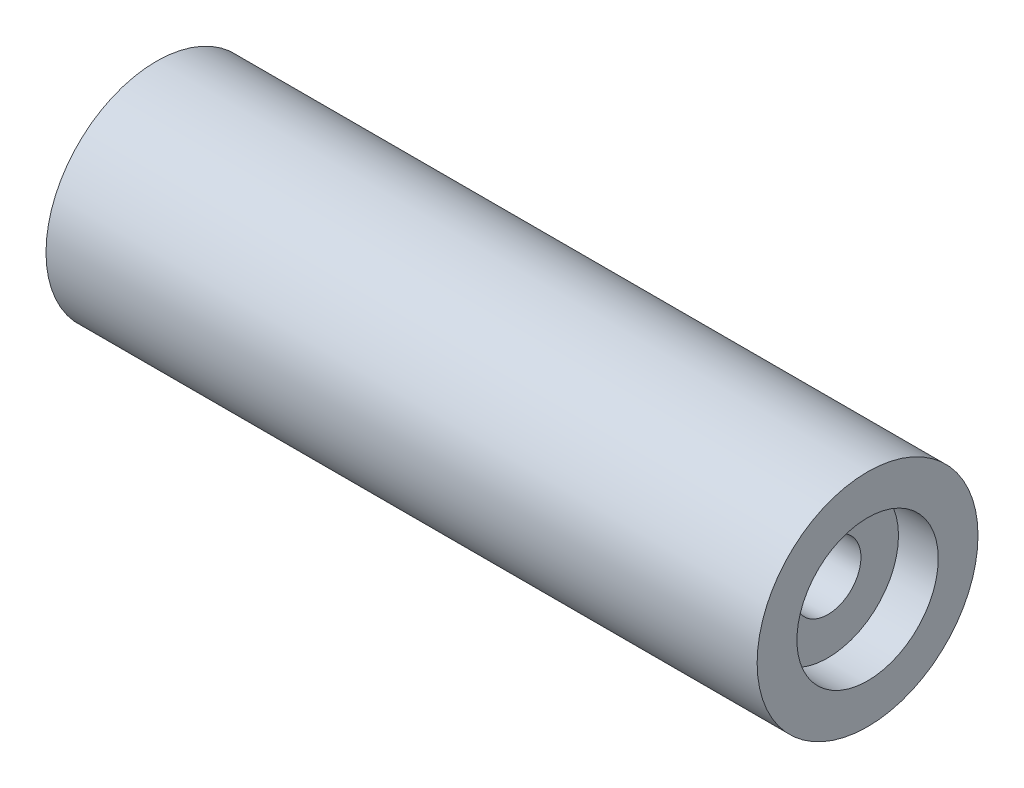
ISO-10303-21;
HEADER;
FILE_DESCRIPTION(('STEP AP214'),'2;1');
FILE_NAME('part.step','',(''),(''),'','','');
FILE_SCHEMA(('AUTOMOTIVE_DESIGN { 1 0 10303 214 1 1 1 1 }'));
ENDSEC;
DATA;
#1=APPLICATION_CONTEXT('core data for automotive mechanical design processes');
#2=APPLICATION_PROTOCOL_DEFINITION('international standard','automotive_design',2000,#1);
#3=PRODUCT_CONTEXT('',#1,'mechanical');
#4=PRODUCT('Part','Part','',(#3));
#5=PRODUCT_RELATED_PRODUCT_CATEGORY('part','',(#4));
#6=PRODUCT_DEFINITION_FORMATION('','',#4);
#7=PRODUCT_DEFINITION_CONTEXT('part definition',#1,'design');
#8=PRODUCT_DEFINITION('design','',#6,#7);
#9=PRODUCT_DEFINITION_SHAPE('','',#8);
#10=(LENGTH_UNIT() NAMED_UNIT(*) SI_UNIT(.MILLI.,.METRE.));
#11=(NAMED_UNIT(*) PLANE_ANGLE_UNIT() SI_UNIT($,.RADIAN.));
#12=(NAMED_UNIT(*) SI_UNIT($,.STERADIAN.) SOLID_ANGLE_UNIT());
#13=UNCERTAINTY_MEASURE_WITH_UNIT(LENGTH_MEASURE(1.E-05),#10,'distance_accuracy_value','');
#14=(GEOMETRIC_REPRESENTATION_CONTEXT(3) GLOBAL_UNCERTAINTY_ASSIGNED_CONTEXT((#13)) GLOBAL_UNIT_ASSIGNED_CONTEXT((#10,
#11,#12)) REPRESENTATION_CONTEXT('',''));
#15=CARTESIAN_POINT('',(0.,0.,0.));
#16=DIRECTION('',(0.,0.,1.));
#17=DIRECTION('',(1.,0.,0.));
#18=AXIS2_PLACEMENT_3D('',#15,#16,#17);
#19=CARTESIAN_POINT('',(80.5,0.,0.));
#20=DIRECTION('',(-1.,0.,0.));
#21=DIRECTION('',(0.,0.,1.));
#22=AXIS2_PLACEMENT_3D('',#19,#20,#21);
#23=CYLINDRICAL_SURFACE('',#22,7.5);
#24=CARTESIAN_POINT('',(71.5,0.,0.));
#25=DIRECTION('',(1.,0.,0.));
#26=DIRECTION('',(0.,0.,-1.));
#27=AXIS2_PLACEMENT_3D('',#24,#25,#26);
#28=CIRCLE('',#27,7.5);
#29=CARTESIAN_POINT('',(71.5,0.,-7.5));
#30=VERTEX_POINT('',#29);
#31=EDGE_CURVE('E59',#30,#30,#28,.T.);
#32=ORIENTED_EDGE('',*,*,#31,.T.);
#33=EDGE_LOOP('',(#32));
#34=FACE_BOUND('',#33,.T.);
#35=CARTESIAN_POINT('',(-71.5,0.,0.));
#36=DIRECTION('',(-1.,0.,0.));
#37=DIRECTION('',(0.,0.,1.));
#38=AXIS2_PLACEMENT_3D('',#35,#36,#37);
#39=CIRCLE('',#38,7.5);
#40=CARTESIAN_POINT('',(-71.5,0.,7.5));
#41=VERTEX_POINT('',#40);
#42=EDGE_CURVE('E50',#41,#41,#39,.T.);
#43=ORIENTED_EDGE('',*,*,#42,.T.);
#44=EDGE_LOOP('',(#43));
#45=FACE_BOUND('',#44,.T.);
#46=ADVANCED_FACE('F46',(#34,#45),#23,.F.);
#47=CARTESIAN_POINT('',(80.5,0.,0.));
#48=DIRECTION('',(1.,0.,0.));
#49=DIRECTION('',(0.,0.,-1.));
#50=AXIS2_PLACEMENT_3D('',#47,#48,#49);
#51=PLANE('',#50);
#52=CARTESIAN_POINT('',(80.5,0.,0.));
#53=DIRECTION('',(1.,0.,0.));
#54=DIRECTION('',(0.,0.,-1.));
#55=AXIS2_PLACEMENT_3D('',#52,#53,#54);
#56=CIRCLE('',#55,16.);
#57=CARTESIAN_POINT('',(80.5,0.,-16.));
#58=VERTEX_POINT('',#57);
#59=EDGE_CURVE('E62',#58,#58,#56,.T.);
#60=ORIENTED_EDGE('',*,*,#59,.F.);
#61=EDGE_LOOP('',(#60));
#62=FACE_BOUND('',#61,.T.);
#63=CARTESIAN_POINT('',(80.5,0.,0.));
#64=DIRECTION('',(1.,0.,0.));
#65=DIRECTION('',(0.,0.,-1.));
#66=AXIS2_PLACEMENT_3D('',#63,#64,#65);
#67=CIRCLE('',#66,25.);
#68=CARTESIAN_POINT('',(80.5,0.,-25.));
#69=VERTEX_POINT('',#68);
#70=EDGE_CURVE('E12',#69,#69,#67,.T.);
#71=ORIENTED_EDGE('',*,*,#70,.T.);
#72=EDGE_LOOP('',(#71));
#73=FACE_BOUND('',#72,.T.);
#74=ADVANCED_FACE('F95',(#62,#73),#51,.T.);
#75=CARTESIAN_POINT('',(-80.5,0.,0.));
#76=DIRECTION('',(1.,0.,0.));
#77=DIRECTION('',(0.,0.,-1.));
#78=AXIS2_PLACEMENT_3D('',#75,#76,#77);
#79=PLANE('',#78);
#80=CARTESIAN_POINT('',(-80.5,0.,0.));
#81=DIRECTION('',(1.,0.,0.));
#82=DIRECTION('',(0.,0.,-1.));
#83=AXIS2_PLACEMENT_3D('',#80,#81,#82);
#84=CIRCLE('',#83,16.);
#85=CARTESIAN_POINT('',(-80.5,0.,-16.));
#86=VERTEX_POINT('',#85);
#87=EDGE_CURVE('E73',#86,#86,#84,.T.);
#88=ORIENTED_EDGE('',*,*,#87,.T.);
#89=EDGE_LOOP('',(#88));
#90=FACE_BOUND('',#89,.T.);
#91=CARTESIAN_POINT('',(-80.5,0.,0.));
#92=DIRECTION('',(1.,0.,0.));
#93=DIRECTION('',(0.,0.,-1.));
#94=AXIS2_PLACEMENT_3D('',#91,#92,#93);
#95=CIRCLE('',#94,25.);
#96=CARTESIAN_POINT('',(-80.5,0.,-25.));
#97=VERTEX_POINT('',#96);
#98=EDGE_CURVE('E54',#97,#97,#95,.T.);
#99=ORIENTED_EDGE('',*,*,#98,.F.);
#100=EDGE_LOOP('',(#99));
#101=FACE_BOUND('',#100,.T.);
#102=ADVANCED_FACE('F100',(#90,#101),#79,.F.);
#103=CARTESIAN_POINT('',(80.5,0.,0.));
#104=DIRECTION('',(-1.,0.,0.));
#105=DIRECTION('',(0.,0.,1.));
#106=AXIS2_PLACEMENT_3D('',#103,#104,#105);
#107=CYLINDRICAL_SURFACE('',#106,25.);
#108=ORIENTED_EDGE('',*,*,#70,.F.);
#109=EDGE_LOOP('',(#108));
#110=FACE_BOUND('',#109,.T.);
#111=ORIENTED_EDGE('',*,*,#98,.T.);
#112=EDGE_LOOP('',(#111));
#113=FACE_BOUND('',#112,.T.);
#114=ADVANCED_FACE('F48',(#110,#113),#107,.T.);
#115=CARTESIAN_POINT('',(71.5,0.,0.));
#116=DIRECTION('',(1.,0.,0.));
#117=DIRECTION('',(0.,0.,-1.));
#118=AXIS2_PLACEMENT_3D('',#115,#116,#117);
#119=CYLINDRICAL_SURFACE('',#118,16.);
#120=CARTESIAN_POINT('',(71.5,0.,0.));
#121=DIRECTION('',(1.,0.,0.));
#122=DIRECTION('',(0.,0.,-1.));
#123=AXIS2_PLACEMENT_3D('',#120,#121,#122);
#124=CIRCLE('',#123,16.);
#125=CARTESIAN_POINT('',(71.5,0.,-16.));
#126=VERTEX_POINT('',#125);
#127=EDGE_CURVE('E65',#126,#126,#124,.T.);
#128=ORIENTED_EDGE('',*,*,#127,.F.);
#129=EDGE_LOOP('',(#128));
#130=FACE_BOUND('',#129,.T.);
#131=ORIENTED_EDGE('',*,*,#59,.T.);
#132=EDGE_LOOP('',(#131));
#133=FACE_BOUND('',#132,.T.);
#134=ADVANCED_FACE('F104',(#130,#133),#119,.F.);
#135=CARTESIAN_POINT('',(71.5,0.,0.));
#136=DIRECTION('',(1.,0.,0.));
#137=DIRECTION('',(0.,0.,-1.));
#138=AXIS2_PLACEMENT_3D('',#135,#136,#137);
#139=PLANE('',#138);
#140=ORIENTED_EDGE('',*,*,#31,.F.);
#141=EDGE_LOOP('',(#140));
#142=FACE_BOUND('',#141,.T.);
#143=ORIENTED_EDGE('',*,*,#127,.T.);
#144=EDGE_LOOP('',(#143));
#145=FACE_BOUND('',#144,.T.);
#146=ADVANCED_FACE('F92',(#142,#145),#139,.T.);
#147=CARTESIAN_POINT('',(-71.5,0.,0.));
#148=DIRECTION('',(-1.,0.,0.));
#149=DIRECTION('',(0.,0.,1.));
#150=AXIS2_PLACEMENT_3D('',#147,#148,#149);
#151=CYLINDRICAL_SURFACE('',#150,16.);
#152=CARTESIAN_POINT('',(-71.5,0.,0.));
#153=DIRECTION('',(1.,0.,0.));
#154=DIRECTION('',(0.,0.,-1.));
#155=AXIS2_PLACEMENT_3D('',#152,#153,#154);
#156=CIRCLE('',#155,16.);
#157=CARTESIAN_POINT('',(-71.5,0.,-16.));
#158=VERTEX_POINT('',#157);
#159=EDGE_CURVE('E76',#158,#158,#156,.T.);
#160=ORIENTED_EDGE('',*,*,#159,.T.);
#161=EDGE_LOOP('',(#160));
#162=FACE_BOUND('',#161,.T.);
#163=ORIENTED_EDGE('',*,*,#87,.F.);
#164=EDGE_LOOP('',(#163));
#165=FACE_BOUND('',#164,.T.);
#166=ADVANCED_FACE('F87',(#162,#165),#151,.F.);
#167=CARTESIAN_POINT('',(-71.5,0.,0.));
#168=DIRECTION('',(-1.,0.,0.));
#169=DIRECTION('',(0.,0.,-1.));
#170=AXIS2_PLACEMENT_3D('',#167,#168,#169);
#171=PLANE('',#170);
#172=ORIENTED_EDGE('',*,*,#42,.F.);
#173=EDGE_LOOP('',(#172));
#174=FACE_BOUND('',#173,.T.);
#175=ORIENTED_EDGE('',*,*,#159,.F.);
#176=EDGE_LOOP('',(#175));
#177=FACE_BOUND('',#176,.T.);
#178=ADVANCED_FACE('F84',(#174,#177),#171,.T.);
#179=CLOSED_SHELL('',(#46,#74,#102,#114,#134,#146,#166,#178));
#180=MANIFOLD_SOLID_BREP('B2',#179);
#181=ADVANCED_BREP_SHAPE_REPRESENTATION('',(#18,#180),#14);
#182=SHAPE_DEFINITION_REPRESENTATION(#9,#181);
ENDSEC;
END-ISO-10303-21;
